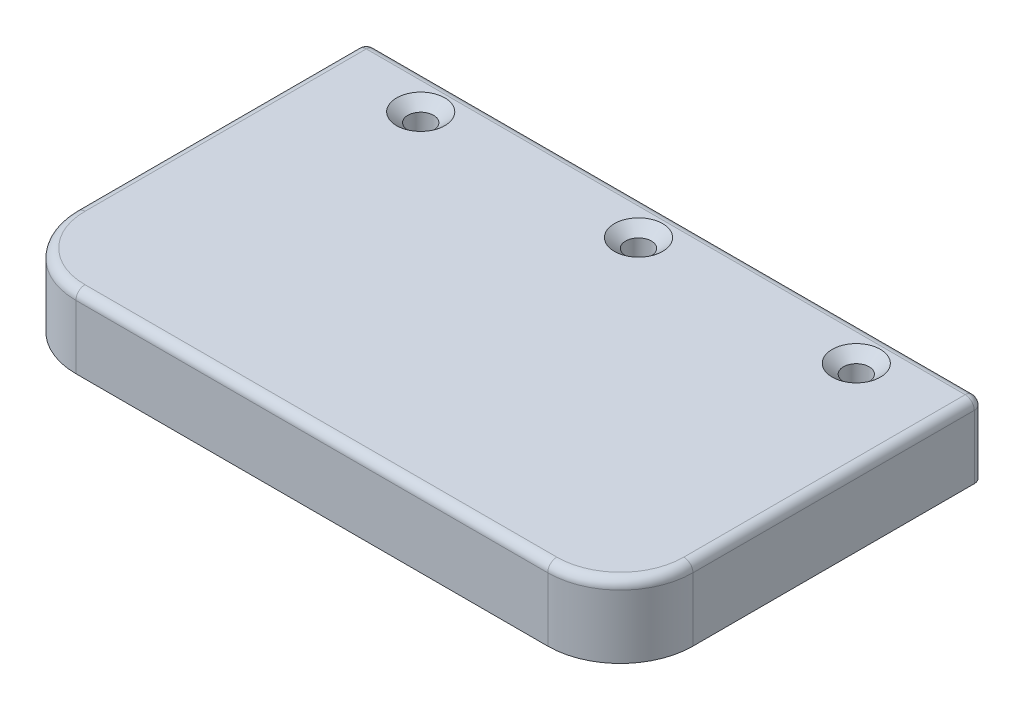
ISO-10303-21;
HEADER;
FILE_DESCRIPTION(('STEP AP214'),'2;1');
FILE_NAME('part.step','',(''),(''),'','','');
FILE_SCHEMA(('AUTOMOTIVE_DESIGN { 1 0 10303 214 1 1 1 1 }'));
ENDSEC;
DATA;
#1=APPLICATION_CONTEXT('core data for automotive mechanical design processes');
#2=APPLICATION_PROTOCOL_DEFINITION('international standard','automotive_design',2000,#1);
#3=PRODUCT_CONTEXT('',#1,'mechanical');
#4=PRODUCT('Part','Part','',(#3));
#5=PRODUCT_RELATED_PRODUCT_CATEGORY('part','',(#4));
#6=PRODUCT_DEFINITION_FORMATION('','',#4);
#7=PRODUCT_DEFINITION_CONTEXT('part definition',#1,'design');
#8=PRODUCT_DEFINITION('design','',#6,#7);
#9=PRODUCT_DEFINITION_SHAPE('','',#8);
#10=(LENGTH_UNIT() NAMED_UNIT(*) SI_UNIT(.MILLI.,.METRE.));
#11=(NAMED_UNIT(*) PLANE_ANGLE_UNIT() SI_UNIT($,.RADIAN.));
#12=(NAMED_UNIT(*) SI_UNIT($,.STERADIAN.) SOLID_ANGLE_UNIT());
#13=UNCERTAINTY_MEASURE_WITH_UNIT(LENGTH_MEASURE(1.E-05),#10,'distance_accuracy_value','');
#14=(GEOMETRIC_REPRESENTATION_CONTEXT(3) GLOBAL_UNCERTAINTY_ASSIGNED_CONTEXT((#13)) GLOBAL_UNIT_ASSIGNED_CONTEXT((#10,
#11,#12)) REPRESENTATION_CONTEXT('',''));
#15=CARTESIAN_POINT('',(0.,0.,0.));
#16=DIRECTION('',(0.,0.,1.));
#17=DIRECTION('',(1.,0.,0.));
#18=AXIS2_PLACEMENT_3D('',#15,#16,#17);
#19=CARTESIAN_POINT('',(53.975,-6.35,31.75));
#20=DIRECTION('',(-1.,0.,0.));
#21=DIRECTION('',(0.,0.,1.));
#22=AXIS2_PLACEMENT_3D('',#19,#20,#21);
#23=PLANE('',#22);
#24=DIRECTION('',(0.,1.,0.));
#25=VECTOR('',#24,1.);
#26=CARTESIAN_POINT('',(53.975,6.35,-30.1625));
#27=LINE('',#26,#25);
#28=CARTESIAN_POINT('',(53.975,-6.35,-30.1625));
#29=VERTEX_POINT('',#28);
#30=CARTESIAN_POINT('',(53.975,4.7625,-30.1625));
#31=VERTEX_POINT('',#30);
#32=EDGE_CURVE('E187',#29,#31,#27,.T.);
#33=ORIENTED_EDGE('',*,*,#32,.T.);
#34=DIRECTION('',(0.,0.,-1.));
#35=VECTOR('',#34,1.);
#36=CARTESIAN_POINT('',(53.975,4.7625,31.75));
#37=LINE('',#36,#35);
#38=CARTESIAN_POINT('',(53.975,4.7625,19.05));
#39=VERTEX_POINT('',#38);
#40=EDGE_CURVE('E189',#31,#39,#37,.F.);
#41=ORIENTED_EDGE('',*,*,#40,.T.);
#42=DIRECTION('',(0.,1.,0.));
#43=VECTOR('',#42,1.);
#44=CARTESIAN_POINT('',(53.975,-6.35,19.05));
#45=LINE('',#44,#43);
#46=CARTESIAN_POINT('',(53.975,-6.35,19.05));
#47=VERTEX_POINT('',#46);
#48=EDGE_CURVE('E160',#39,#47,#45,.F.);
#49=ORIENTED_EDGE('',*,*,#48,.T.);
#50=DIRECTION('',(0.,0.,-1.));
#51=VECTOR('',#50,1.);
#52=CARTESIAN_POINT('',(53.975,-6.35,31.75));
#53=LINE('',#52,#51);
#54=EDGE_CURVE('E143',#47,#29,#53,.T.);
#55=ORIENTED_EDGE('',*,*,#54,.T.);
#56=EDGE_LOOP('',(#33,#41,#49,#55));
#57=FACE_BOUND('',#56,.T.);
#58=ADVANCED_FACE('F35',(#57),#23,.F.);
#59=CARTESIAN_POINT('',(-53.975,6.35,31.75));
#60=DIRECTION('',(0.,-1.,0.));
#61=DIRECTION('',(0.,0.,-1.));
#62=AXIS2_PLACEMENT_3D('',#59,#60,#61);
#63=PLANE('',#62);
#64=DIRECTION('',(0.,0.,-1.));
#65=VECTOR('',#64,1.);
#66=CARTESIAN_POINT('',(52.3875,6.35,31.75));
#67=LINE('',#66,#65);
#68=CARTESIAN_POINT('',(52.3875,6.35,19.05));
#69=VERTEX_POINT('',#68);
#70=CARTESIAN_POINT('',(52.3875,6.35,-30.1625));
#71=VERTEX_POINT('',#70);
#72=EDGE_CURVE('E182',#69,#71,#67,.T.);
#73=ORIENTED_EDGE('',*,*,#72,.T.);
#74=DIRECTION('',(-1.,0.,0.));
#75=VECTOR('',#74,1.);
#76=CARTESIAN_POINT('',(-53.975,6.35,-30.1625));
#77=LINE('',#76,#75);
#78=CARTESIAN_POINT('',(-52.3875,6.35,-30.1625));
#79=VERTEX_POINT('',#78);
#80=EDGE_CURVE('E185',#71,#79,#77,.T.);
#81=ORIENTED_EDGE('',*,*,#80,.T.);
#82=DIRECTION('',(0.,0.,-1.));
#83=VECTOR('',#82,1.);
#84=CARTESIAN_POINT('',(-52.3875,6.35,31.75));
#85=LINE('',#84,#83);
#86=CARTESIAN_POINT('',(-52.3875,6.35,19.05));
#87=VERTEX_POINT('',#86);
#88=EDGE_CURVE('E178',#79,#87,#85,.F.);
#89=ORIENTED_EDGE('',*,*,#88,.T.);
#90=CARTESIAN_POINT('',(-41.275,6.35,19.05));
#91=DIRECTION('',(0.,-1.,0.));
#92=DIRECTION('',(0.,0.,-1.));
#93=AXIS2_PLACEMENT_3D('',#90,#91,#92);
#94=CIRCLE('',#93,11.1125);
#95=CARTESIAN_POINT('',(-41.275,6.35,30.1625));
#96=VERTEX_POINT('',#95);
#97=EDGE_CURVE('E176',#87,#96,#94,.F.);
#98=ORIENTED_EDGE('',*,*,#97,.T.);
#99=DIRECTION('',(-1.,0.,0.));
#100=VECTOR('',#99,1.);
#101=CARTESIAN_POINT('',(-53.975,6.35,30.1625));
#102=LINE('',#101,#100);
#103=CARTESIAN_POINT('',(41.275,6.35,30.1625));
#104=VERTEX_POINT('',#103);
#105=EDGE_CURVE('E162',#96,#104,#102,.F.);
#106=ORIENTED_EDGE('',*,*,#105,.T.);
#107=CARTESIAN_POINT('',(41.275,6.35,19.05));
#108=DIRECTION('',(0.,-1.,0.));
#109=DIRECTION('',(0.,0.,-1.));
#110=AXIS2_PLACEMENT_3D('',#107,#108,#109);
#111=CIRCLE('',#110,11.1125);
#112=EDGE_CURVE('E180',#104,#69,#111,.F.);
#113=ORIENTED_EDGE('',*,*,#112,.T.);
#114=EDGE_LOOP('',(#73,#81,#89,#98,#106,#113));
#115=FACE_BOUND('',#114,.T.);
#116=CARTESIAN_POINT('',(-38.1,6.35,-25.4));
#117=DIRECTION('',(0.,1.,0.));
#118=DIRECTION('',(0.,0.,1.));
#119=AXIS2_PLACEMENT_3D('',#116,#117,#118);
#120=CIRCLE('',#119,4.2164);
#121=CARTESIAN_POINT('',(-38.1,6.35,-21.1836));
#122=VERTEX_POINT('',#121);
#123=EDGE_CURVE('E235',#122,#122,#120,.T.);
#124=ORIENTED_EDGE('',*,*,#123,.F.);
#125=EDGE_LOOP('',(#124));
#126=FACE_BOUND('',#125,.T.);
#127=CARTESIAN_POINT('',(38.1,6.35,-25.4));
#128=DIRECTION('',(0.,1.,0.));
#129=DIRECTION('',(0.,0.,1.));
#130=AXIS2_PLACEMENT_3D('',#127,#128,#129);
#131=CIRCLE('',#130,4.2164);
#132=CARTESIAN_POINT('',(38.1,6.35,-21.1836));
#133=VERTEX_POINT('',#132);
#134=EDGE_CURVE('E173',#133,#133,#131,.T.);
#135=ORIENTED_EDGE('',*,*,#134,.F.);
#136=EDGE_LOOP('',(#135));
#137=FACE_BOUND('',#136,.T.);
#138=CARTESIAN_POINT('',(0.,6.35,-25.4));
#139=DIRECTION('',(0.,1.,0.));
#140=DIRECTION('',(0.,0.,1.));
#141=AXIS2_PLACEMENT_3D('',#138,#139,#140);
#142=CIRCLE('',#141,4.2164);
#143=CARTESIAN_POINT('',(0.,6.35,-21.1836));
#144=VERTEX_POINT('',#143);
#145=EDGE_CURVE('E168',#144,#144,#142,.T.);
#146=ORIENTED_EDGE('',*,*,#145,.F.);
#147=EDGE_LOOP('',(#146));
#148=FACE_BOUND('',#147,.T.);
#149=ADVANCED_FACE('F272',(#115,#126,#137,#148),#63,.F.);
#150=CARTESIAN_POINT('',(-53.975,-6.35,31.75));
#151=DIRECTION('',(1.,0.,0.));
#152=DIRECTION('',(0.,0.,-1.));
#153=AXIS2_PLACEMENT_3D('',#150,#151,#152);
#154=PLANE('',#153);
#155=DIRECTION('',(0.,-1.,0.));
#156=VECTOR('',#155,1.);
#157=CARTESIAN_POINT('',(-53.975,-6.35,19.05));
#158=LINE('',#157,#156);
#159=CARTESIAN_POINT('',(-53.975,-6.35,19.05));
#160=VERTEX_POINT('',#159);
#161=CARTESIAN_POINT('',(-53.975,4.7625,19.05));
#162=VERTEX_POINT('',#161);
#163=EDGE_CURVE('E135',#160,#162,#158,.F.);
#164=ORIENTED_EDGE('',*,*,#163,.T.);
#165=DIRECTION('',(0.,0.,-1.));
#166=VECTOR('',#165,1.);
#167=CARTESIAN_POINT('',(-53.975,4.7625,31.75));
#168=LINE('',#167,#166);
#169=CARTESIAN_POINT('',(-53.975,4.7625,-30.1625));
#170=VERTEX_POINT('',#169);
#171=EDGE_CURVE('E196',#162,#170,#168,.T.);
#172=ORIENTED_EDGE('',*,*,#171,.T.);
#173=DIRECTION('',(0.,-1.,0.));
#174=VECTOR('',#173,1.);
#175=CARTESIAN_POINT('',(-53.975,-6.35,-30.1625));
#176=LINE('',#175,#174);
#177=CARTESIAN_POINT('',(-53.975,-6.35,-30.1625));
#178=VERTEX_POINT('',#177);
#179=EDGE_CURVE('E194',#170,#178,#176,.T.);
#180=ORIENTED_EDGE('',*,*,#179,.T.);
#181=DIRECTION('',(0.,0.,-1.));
#182=VECTOR('',#181,1.);
#183=CARTESIAN_POINT('',(-53.975,-6.35,31.75));
#184=LINE('',#183,#182);
#185=EDGE_CURVE('E147',#160,#178,#184,.T.);
#186=ORIENTED_EDGE('',*,*,#185,.F.);
#187=EDGE_LOOP('',(#164,#172,#180,#186));
#188=FACE_BOUND('',#187,.T.);
#189=ADVANCED_FACE('F279',(#188),#154,.F.);
#190=CARTESIAN_POINT('',(-53.975,-6.35,31.75));
#191=DIRECTION('',(0.,1.,0.));
#192=DIRECTION('',(0.,0.,1.));
#193=AXIS2_PLACEMENT_3D('',#190,#191,#192);
#194=PLANE('',#193);
#195=CARTESIAN_POINT('',(-38.1,-6.35,-25.4));
#196=DIRECTION('',(0.,1.,0.));
#197=DIRECTION('',(0.,0.,1.));
#198=AXIS2_PLACEMENT_3D('',#195,#196,#197);
#199=CIRCLE('',#198,2.2479);
#200=CARTESIAN_POINT('',(-38.1,-6.35,-23.1521));
#201=VERTEX_POINT('',#200);
#202=EDGE_CURVE('E170',#201,#201,#199,.T.);
#203=ORIENTED_EDGE('',*,*,#202,.T.);
#204=EDGE_LOOP('',(#203));
#205=FACE_BOUND('',#204,.T.);
#206=CARTESIAN_POINT('',(38.1,-6.35,-25.4));
#207=DIRECTION('',(0.,1.,0.));
#208=DIRECTION('',(0.,0.,1.));
#209=AXIS2_PLACEMENT_3D('',#206,#207,#208);
#210=CIRCLE('',#209,2.2479);
#211=CARTESIAN_POINT('',(38.1,-6.35,-23.1521));
#212=VERTEX_POINT('',#211);
#213=EDGE_CURVE('E165',#212,#212,#210,.T.);
#214=ORIENTED_EDGE('',*,*,#213,.T.);
#215=EDGE_LOOP('',(#214));
#216=FACE_BOUND('',#215,.T.);
#217=CARTESIAN_POINT('',(0.,-6.35,-25.4));
#218=DIRECTION('',(0.,1.,0.));
#219=DIRECTION('',(0.,0.,1.));
#220=AXIS2_PLACEMENT_3D('',#217,#218,#219);
#221=CIRCLE('',#220,2.2479);
#222=CARTESIAN_POINT('',(0.,-6.35,-23.1521));
#223=VERTEX_POINT('',#222);
#224=EDGE_CURVE('E150',#223,#223,#221,.T.);
#225=ORIENTED_EDGE('',*,*,#224,.T.);
#226=EDGE_LOOP('',(#225));
#227=FACE_BOUND('',#226,.T.);
#228=ORIENTED_EDGE('',*,*,#185,.T.);
#229=CARTESIAN_POINT('',(-52.3875,-6.35,-30.1625));
#230=DIRECTION('',(0.,1.,0.));
#231=DIRECTION('',(0.,0.,1.));
#232=AXIS2_PLACEMENT_3D('',#229,#230,#231);
#233=CIRCLE('',#232,1.5875);
#234=CARTESIAN_POINT('',(-52.3875,-6.35,-31.75));
#235=VERTEX_POINT('',#234);
#236=EDGE_CURVE('E202',#178,#235,#233,.F.);
#237=ORIENTED_EDGE('',*,*,#236,.T.);
#238=DIRECTION('',(1.,0.,0.));
#239=VECTOR('',#238,1.);
#240=CARTESIAN_POINT('',(-53.975,-6.35,-31.75));
#241=LINE('',#240,#239);
#242=CARTESIAN_POINT('',(52.3875,-6.35,-31.75));
#243=VERTEX_POINT('',#242);
#244=EDGE_CURVE('E144',#235,#243,#241,.T.);
#245=ORIENTED_EDGE('',*,*,#244,.T.);
#246=CARTESIAN_POINT('',(52.3875,-6.35,-30.1625));
#247=DIRECTION('',(0.,1.,0.));
#248=DIRECTION('',(0.,0.,1.));
#249=AXIS2_PLACEMENT_3D('',#246,#247,#248);
#250=CIRCLE('',#249,1.5875);
#251=EDGE_CURVE('E200',#243,#29,#250,.F.);
#252=ORIENTED_EDGE('',*,*,#251,.T.);
#253=ORIENTED_EDGE('',*,*,#54,.F.);
#254=CARTESIAN_POINT('',(41.275,-6.35,19.05));
#255=DIRECTION('',(0.,1.,0.));
#256=DIRECTION('',(0.,0.,1.));
#257=AXIS2_PLACEMENT_3D('',#254,#255,#256);
#258=CIRCLE('',#257,12.7);
#259=CARTESIAN_POINT('',(41.275,-6.35,31.75));
#260=VERTEX_POINT('',#259);
#261=EDGE_CURVE('E128',#47,#260,#258,.F.);
#262=ORIENTED_EDGE('',*,*,#261,.T.);
#263=DIRECTION('',(1.,0.,0.));
#264=VECTOR('',#263,1.);
#265=CARTESIAN_POINT('',(-53.975,-6.35,31.75));
#266=LINE('',#265,#264);
#267=CARTESIAN_POINT('',(-41.275,-6.35,31.75));
#268=VERTEX_POINT('',#267);
#269=EDGE_CURVE('E123',#268,#260,#266,.T.);
#270=ORIENTED_EDGE('',*,*,#269,.F.);
#271=CARTESIAN_POINT('',(-41.275,-6.35,19.05));
#272=DIRECTION('',(0.,1.,0.));
#273=DIRECTION('',(0.,0.,1.));
#274=AXIS2_PLACEMENT_3D('',#271,#272,#273);
#275=CIRCLE('',#274,12.7);
#276=EDGE_CURVE('E132',#268,#160,#275,.F.);
#277=ORIENTED_EDGE('',*,*,#276,.T.);
#278=EDGE_LOOP('',(#228,#237,#245,#252,#253,#262,#270,#277));
#279=FACE_BOUND('',#278,.T.);
#280=ADVANCED_FACE('F140',(#205,#216,#227,#279),#194,.F.);
#281=CARTESIAN_POINT('',(0.,0.,31.75));
#282=DIRECTION('',(0.,0.,-1.));
#283=DIRECTION('',(-1.,0.,0.));
#284=AXIS2_PLACEMENT_3D('',#281,#282,#283);
#285=PLANE('',#284);
#286=DIRECTION('',(0.,1.,0.));
#287=VECTOR('',#286,1.);
#288=CARTESIAN_POINT('',(41.275,0.,31.75));
#289=LINE('',#288,#287);
#290=CARTESIAN_POINT('',(41.275,4.7625,31.75));
#291=VERTEX_POINT('',#290);
#292=EDGE_CURVE('E129',#260,#291,#289,.T.);
#293=ORIENTED_EDGE('',*,*,#292,.T.);
#294=DIRECTION('',(-1.,0.,0.));
#295=VECTOR('',#294,1.);
#296=CARTESIAN_POINT('',(0.,4.7625,31.75));
#297=LINE('',#296,#295);
#298=CARTESIAN_POINT('',(-41.275,4.7625,31.75));
#299=VERTEX_POINT('',#298);
#300=EDGE_CURVE('E11',#291,#299,#297,.T.);
#301=ORIENTED_EDGE('',*,*,#300,.T.);
#302=DIRECTION('',(0.,-1.,0.));
#303=VECTOR('',#302,1.);
#304=CARTESIAN_POINT('',(-41.275,0.,31.75));
#305=LINE('',#304,#303);
#306=EDGE_CURVE('E118',#299,#268,#305,.T.);
#307=ORIENTED_EDGE('',*,*,#306,.T.);
#308=ORIENTED_EDGE('',*,*,#269,.T.);
#309=EDGE_LOOP('',(#293,#301,#307,#308));
#310=FACE_BOUND('',#309,.T.);
#311=ADVANCED_FACE('F121',(#310),#285,.F.);
#312=CARTESIAN_POINT('',(0.,0.,-31.75));
#313=DIRECTION('',(0.,0.,-1.));
#314=DIRECTION('',(-1.,0.,0.));
#315=AXIS2_PLACEMENT_3D('',#312,#313,#314);
#316=PLANE('',#315);
#317=ORIENTED_EDGE('',*,*,#244,.F.);
#318=DIRECTION('',(0.,-1.,0.));
#319=VECTOR('',#318,1.);
#320=CARTESIAN_POINT('',(-52.3875,6.35,-31.75));
#321=LINE('',#320,#319);
#322=CARTESIAN_POINT('',(-52.3875,4.7625,-31.75));
#323=VERTEX_POINT('',#322);
#324=EDGE_CURVE('E44',#235,#323,#321,.F.);
#325=ORIENTED_EDGE('',*,*,#324,.T.);
#326=DIRECTION('',(-1.,0.,0.));
#327=VECTOR('',#326,1.);
#328=CARTESIAN_POINT('',(53.975,4.7625,-31.75));
#329=LINE('',#328,#327);
#330=CARTESIAN_POINT('',(52.3875,4.7625,-31.75));
#331=VERTEX_POINT('',#330);
#332=EDGE_CURVE('E52',#323,#331,#329,.F.);
#333=ORIENTED_EDGE('',*,*,#332,.T.);
#334=DIRECTION('',(0.,1.,0.));
#335=VECTOR('',#334,1.);
#336=CARTESIAN_POINT('',(52.3875,-6.35,-31.75));
#337=LINE('',#336,#335);
#338=EDGE_CURVE('E205',#331,#243,#337,.F.);
#339=ORIENTED_EDGE('',*,*,#338,.T.);
#340=EDGE_LOOP('',(#317,#325,#333,#339));
#341=FACE_BOUND('',#340,.T.);
#342=ADVANCED_FACE('F286',(#341),#316,.T.);
#343=CARTESIAN_POINT('',(-41.275,0.,19.05));
#344=DIRECTION('',(0.,-1.,0.));
#345=DIRECTION('',(0.,0.,-1.));
#346=AXIS2_PLACEMENT_3D('',#343,#344,#345);
#347=CYLINDRICAL_SURFACE('',#346,12.7);
#348=ORIENTED_EDGE('',*,*,#306,.F.);
#349=CARTESIAN_POINT('',(-41.275,4.7625,19.05));
#350=DIRECTION('',(0.,-1.,0.));
#351=DIRECTION('',(0.,0.,-1.));
#352=AXIS2_PLACEMENT_3D('',#349,#350,#351);
#353=CIRCLE('',#352,12.7);
#354=EDGE_CURVE('E198',#299,#162,#353,.T.);
#355=ORIENTED_EDGE('',*,*,#354,.T.);
#356=ORIENTED_EDGE('',*,*,#163,.F.);
#357=ORIENTED_EDGE('',*,*,#276,.F.);
#358=EDGE_LOOP('',(#348,#355,#356,#357));
#359=FACE_BOUND('',#358,.T.);
#360=ADVANCED_FACE('F133',(#359),#347,.T.);
#361=CARTESIAN_POINT('',(41.275,0.,19.05));
#362=DIRECTION('',(0.,1.,0.));
#363=DIRECTION('',(0.,0.,1.));
#364=AXIS2_PLACEMENT_3D('',#361,#362,#363);
#365=CYLINDRICAL_SURFACE('',#364,12.7);
#366=ORIENTED_EDGE('',*,*,#48,.F.);
#367=CARTESIAN_POINT('',(41.275,4.7625,19.05));
#368=DIRECTION('',(0.,-1.,0.));
#369=DIRECTION('',(0.,0.,-1.));
#370=AXIS2_PLACEMENT_3D('',#367,#368,#369);
#371=CIRCLE('',#370,12.7);
#372=EDGE_CURVE('E192',#39,#291,#371,.T.);
#373=ORIENTED_EDGE('',*,*,#372,.T.);
#374=ORIENTED_EDGE('',*,*,#292,.F.);
#375=ORIENTED_EDGE('',*,*,#261,.F.);
#376=EDGE_LOOP('',(#366,#373,#374,#375));
#377=FACE_BOUND('',#376,.T.);
#378=ADVANCED_FACE('F269',(#377),#365,.T.);
#379=CARTESIAN_POINT('',(0.,6.35,-25.4));
#380=DIRECTION('',(0.,1.,0.));
#381=DIRECTION('',(0.,0.,1.));
#382=AXIS2_PLACEMENT_3D('',#379,#380,#381);
#383=CYLINDRICAL_SURFACE('',#382,2.2479);
#384=CARTESIAN_POINT('',(0.,4.69823237602752,-25.4));
#385=DIRECTION('',(0.,1.,0.));
#386=DIRECTION('',(0.,0.,1.));
#387=AXIS2_PLACEMENT_3D('',#384,#385,#386);
#388=CIRCLE('',#387,2.2479);
#389=CARTESIAN_POINT('',(0.,4.69823237602752,-23.1521));
#390=VERTEX_POINT('',#389);
#391=EDGE_CURVE('E153',#390,#390,#388,.T.);
#392=ORIENTED_EDGE('',*,*,#391,.T.);
#393=EDGE_LOOP('',(#392));
#394=FACE_BOUND('',#393,.T.);
#395=ORIENTED_EDGE('',*,*,#224,.F.);
#396=EDGE_LOOP('',(#395));
#397=FACE_BOUND('',#396,.T.);
#398=ADVANCED_FACE('F255',(#394,#397),#383,.F.);
#399=CARTESIAN_POINT('',(0.,6.35,-25.4));
#400=DIRECTION('',(0.,1.,0.));
#401=DIRECTION('',(0.,0.,1.));
#402=AXIS2_PLACEMENT_3D('',#399,#400,#401);
#403=CONICAL_SURFACE('',#402,4.2164,0.872664625997165);
#404=ORIENTED_EDGE('',*,*,#391,.F.);
#405=EDGE_LOOP('',(#404));
#406=FACE_BOUND('',#405,.T.);
#407=ORIENTED_EDGE('',*,*,#145,.T.);
#408=EDGE_LOOP('',(#407));
#409=FACE_BOUND('',#408,.T.);
#410=ADVANCED_FACE('F258',(#406,#409),#403,.F.);
#411=CARTESIAN_POINT('',(38.1,6.35,-25.4));
#412=DIRECTION('',(0.,1.,0.));
#413=DIRECTION('',(0.,0.,1.));
#414=AXIS2_PLACEMENT_3D('',#411,#412,#413);
#415=CYLINDRICAL_SURFACE('',#414,2.2479);
#416=CARTESIAN_POINT('',(38.1,4.69823237602752,-25.4));
#417=DIRECTION('',(0.,1.,0.));
#418=DIRECTION('',(0.,0.,1.));
#419=AXIS2_PLACEMENT_3D('',#416,#417,#418);
#420=CIRCLE('',#419,2.2479);
#421=CARTESIAN_POINT('',(38.1,4.69823237602752,-23.1521));
#422=VERTEX_POINT('',#421);
#423=EDGE_CURVE('E169',#422,#422,#420,.T.);
#424=ORIENTED_EDGE('',*,*,#423,.T.);
#425=EDGE_LOOP('',(#424));
#426=FACE_BOUND('',#425,.T.);
#427=ORIENTED_EDGE('',*,*,#213,.F.);
#428=EDGE_LOOP('',(#427));
#429=FACE_BOUND('',#428,.T.);
#430=ADVANCED_FACE('F260',(#426,#429),#415,.F.);
#431=CARTESIAN_POINT('',(38.1,6.35,-25.4));
#432=DIRECTION('',(0.,1.,0.));
#433=DIRECTION('',(0.,0.,1.));
#434=AXIS2_PLACEMENT_3D('',#431,#432,#433);
#435=CONICAL_SURFACE('',#434,4.2164,0.872664625997165);
#436=ORIENTED_EDGE('',*,*,#423,.F.);
#437=EDGE_LOOP('',(#436));
#438=FACE_BOUND('',#437,.T.);
#439=ORIENTED_EDGE('',*,*,#134,.T.);
#440=EDGE_LOOP('',(#439));
#441=FACE_BOUND('',#440,.T.);
#442=ADVANCED_FACE('F266',(#438,#441),#435,.F.);
#443=CARTESIAN_POINT('',(-38.1,6.35,-25.4));
#444=DIRECTION('',(0.,1.,0.));
#445=DIRECTION('',(0.,0.,1.));
#446=AXIS2_PLACEMENT_3D('',#443,#444,#445);
#447=CYLINDRICAL_SURFACE('',#446,2.2479);
#448=CARTESIAN_POINT('',(-38.1,4.69823237602752,-25.4));
#449=DIRECTION('',(0.,1.,0.));
#450=DIRECTION('',(0.,0.,1.));
#451=AXIS2_PLACEMENT_3D('',#448,#449,#450);
#452=CIRCLE('',#451,2.2479);
#453=CARTESIAN_POINT('',(-38.1,4.69823237602752,-23.1521));
#454=VERTEX_POINT('',#453);
#455=EDGE_CURVE('E174',#454,#454,#452,.T.);
#456=ORIENTED_EDGE('',*,*,#455,.T.);
#457=EDGE_LOOP('',(#456));
#458=FACE_BOUND('',#457,.T.);
#459=ORIENTED_EDGE('',*,*,#202,.F.);
#460=EDGE_LOOP('',(#459));
#461=FACE_BOUND('',#460,.T.);
#462=ADVANCED_FACE('F438',(#458,#461),#447,.F.);
#463=CARTESIAN_POINT('',(-38.1,6.35,-25.4));
#464=DIRECTION('',(0.,1.,0.));
#465=DIRECTION('',(0.,0.,1.));
#466=AXIS2_PLACEMENT_3D('',#463,#464,#465);
#467=CONICAL_SURFACE('',#466,4.2164,0.872664625997165);
#468=ORIENTED_EDGE('',*,*,#455,.F.);
#469=EDGE_LOOP('',(#468));
#470=FACE_BOUND('',#469,.T.);
#471=ORIENTED_EDGE('',*,*,#123,.T.);
#472=EDGE_LOOP('',(#471));
#473=FACE_BOUND('',#472,.T.);
#474=ADVANCED_FACE('F325',(#470,#473),#467,.F.);
#475=CARTESIAN_POINT('',(-52.3875,4.7625,31.75));
#476=DIRECTION('',(0.,0.,-1.));
#477=DIRECTION('',(-1.,0.,0.));
#478=AXIS2_PLACEMENT_3D('',#475,#476,#477);
#479=CYLINDRICAL_SURFACE('',#478,1.5875);
#480=CARTESIAN_POINT('',(-52.3875,4.7625,-30.1625));
#481=DIRECTION('',(0.,0.,-1.));
#482=DIRECTION('',(-1.,0.,0.));
#483=AXIS2_PLACEMENT_3D('',#480,#481,#482);
#484=CIRCLE('',#483,1.5875);
#485=EDGE_CURVE('E229',#170,#79,#484,.T.);
#486=ORIENTED_EDGE('',*,*,#485,.F.);
#487=ORIENTED_EDGE('',*,*,#171,.F.);
#488=CARTESIAN_POINT('',(-52.3875,4.7625,19.05));
#489=DIRECTION('',(0.,0.,1.));
#490=DIRECTION('',(1.,0.,0.));
#491=AXIS2_PLACEMENT_3D('',#488,#489,#490);
#492=CIRCLE('',#491,1.5875);
#493=EDGE_CURVE('E39',#87,#162,#492,.T.);
#494=ORIENTED_EDGE('',*,*,#493,.F.);
#495=ORIENTED_EDGE('',*,*,#88,.F.);
#496=EDGE_LOOP('',(#486,#487,#494,#495));
#497=FACE_BOUND('',#496,.T.);
#498=ADVANCED_FACE('F37',(#497),#479,.T.);
#499=CARTESIAN_POINT('',(-52.3875,-6.35,-30.1625));
#500=DIRECTION('',(0.,1.,0.));
#501=DIRECTION('',(0.,0.,1.));
#502=AXIS2_PLACEMENT_3D('',#499,#500,#501);
#503=CYLINDRICAL_SURFACE('',#502,1.5875);
#504=ORIENTED_EDGE('',*,*,#236,.F.);
#505=ORIENTED_EDGE('',*,*,#179,.F.);
#506=CARTESIAN_POINT('',(-52.3875,4.7625,-30.1625));
#507=DIRECTION('',(0.,1.,0.));
#508=DIRECTION('',(0.,0.,1.));
#509=AXIS2_PLACEMENT_3D('',#506,#507,#508);
#510=CIRCLE('',#509,1.5875);
#511=EDGE_CURVE('E227',#323,#170,#510,.T.);
#512=ORIENTED_EDGE('',*,*,#511,.F.);
#513=ORIENTED_EDGE('',*,*,#324,.F.);
#514=EDGE_LOOP('',(#504,#505,#512,#513));
#515=FACE_BOUND('',#514,.T.);
#516=ADVANCED_FACE('F319',(#515),#503,.T.);
#517=CARTESIAN_POINT('',(-41.275,4.7625,19.05));
#518=DIRECTION('',(0.,-1.,0.));
#519=DIRECTION('',(0.,0.,-1.));
#520=AXIS2_PLACEMENT_3D('',#517,#518,#519);
#521=TOROIDAL_SURFACE('',#520,11.1125,1.5875);
#522=ORIENTED_EDGE('',*,*,#493,.T.);
#523=ORIENTED_EDGE('',*,*,#354,.F.);
#524=CARTESIAN_POINT('',(-41.275,4.7625,30.1625));
#525=DIRECTION('',(1.,0.,0.));
#526=DIRECTION('',(0.,0.,-1.));
#527=AXIS2_PLACEMENT_3D('',#524,#525,#526);
#528=CIRCLE('',#527,1.5875);
#529=EDGE_CURVE('E224',#96,#299,#528,.T.);
#530=ORIENTED_EDGE('',*,*,#529,.F.);
#531=ORIENTED_EDGE('',*,*,#97,.F.);
#532=EDGE_LOOP('',(#522,#523,#530,#531));
#533=FACE_BOUND('',#532,.T.);
#534=ADVANCED_FACE('F317',(#533),#521,.T.);
#535=CARTESIAN_POINT('',(-52.3875,4.7625,-30.1625));
#536=DIRECTION('',(0.,0.,1.));
#537=DIRECTION('',(1.,0.,0.));
#538=AXIS2_PLACEMENT_3D('',#535,#536,#537);
#539=SPHERICAL_SURFACE('',#538,1.5875);
#540=ORIENTED_EDGE('',*,*,#511,.T.);
#541=ORIENTED_EDGE('',*,*,#485,.T.);
#542=CARTESIAN_POINT('',(-52.3875,4.7625,-30.1625));
#543=DIRECTION('',(-1.,0.,0.));
#544=DIRECTION('',(0.,0.,1.));
#545=AXIS2_PLACEMENT_3D('',#542,#543,#544);
#546=CIRCLE('',#545,1.5875);
#547=EDGE_CURVE('E221',#323,#79,#546,.F.);
#548=ORIENTED_EDGE('',*,*,#547,.F.);
#549=EDGE_LOOP('',(#540,#541,#548));
#550=FACE_BOUND('',#549,.T.);
#551=ADVANCED_FACE('F313',(#550),#539,.T.);
#552=CARTESIAN_POINT('',(0.,4.7625,30.1625));
#553=DIRECTION('',(-1.,0.,0.));
#554=DIRECTION('',(0.,0.,1.));
#555=AXIS2_PLACEMENT_3D('',#552,#553,#554);
#556=CYLINDRICAL_SURFACE('',#555,1.5875);
#557=ORIENTED_EDGE('',*,*,#529,.T.);
#558=ORIENTED_EDGE('',*,*,#300,.F.);
#559=CARTESIAN_POINT('',(41.275,4.7625,30.1625));
#560=DIRECTION('',(1.,0.,0.));
#561=DIRECTION('',(0.,0.,-1.));
#562=AXIS2_PLACEMENT_3D('',#559,#560,#561);
#563=CIRCLE('',#562,1.5875);
#564=EDGE_CURVE('E218',#104,#291,#563,.T.);
#565=ORIENTED_EDGE('',*,*,#564,.F.);
#566=ORIENTED_EDGE('',*,*,#105,.F.);
#567=EDGE_LOOP('',(#557,#558,#565,#566));
#568=FACE_BOUND('',#567,.T.);
#569=ADVANCED_FACE('F309',(#568),#556,.T.);
#570=CARTESIAN_POINT('',(-53.975,4.7625,-30.1625));
#571=DIRECTION('',(1.,0.,0.));
#572=DIRECTION('',(0.,0.,-1.));
#573=AXIS2_PLACEMENT_3D('',#570,#571,#572);
#574=CYLINDRICAL_SURFACE('',#573,1.5875);
#575=ORIENTED_EDGE('',*,*,#547,.T.);
#576=ORIENTED_EDGE('',*,*,#80,.F.);
#577=CARTESIAN_POINT('',(52.3875,4.7625,-30.1625));
#578=DIRECTION('',(1.,0.,0.));
#579=DIRECTION('',(0.,1.,0.));
#580=AXIS2_PLACEMENT_3D('',#577,#578,#579);
#581=CIRCLE('',#580,1.5875);
#582=EDGE_CURVE('E215',#331,#71,#581,.T.);
#583=ORIENTED_EDGE('',*,*,#582,.F.);
#584=ORIENTED_EDGE('',*,*,#332,.F.);
#585=EDGE_LOOP('',(#575,#576,#583,#584));
#586=FACE_BOUND('',#585,.T.);
#587=ADVANCED_FACE('F305',(#586),#574,.T.);
#588=CARTESIAN_POINT('',(52.3875,-6.35,-30.1625));
#589=DIRECTION('',(0.,-1.,0.));
#590=DIRECTION('',(0.,0.,-1.));
#591=AXIS2_PLACEMENT_3D('',#588,#589,#590);
#592=CYLINDRICAL_SURFACE('',#591,1.5875);
#593=ORIENTED_EDGE('',*,*,#251,.F.);
#594=ORIENTED_EDGE('',*,*,#338,.F.);
#595=CARTESIAN_POINT('',(52.3875,4.7625,-30.1625));
#596=DIRECTION('',(0.,1.,0.));
#597=DIRECTION('',(0.,0.,1.));
#598=AXIS2_PLACEMENT_3D('',#595,#596,#597);
#599=CIRCLE('',#598,1.5875);
#600=EDGE_CURVE('E212',#31,#331,#599,.T.);
#601=ORIENTED_EDGE('',*,*,#600,.F.);
#602=ORIENTED_EDGE('',*,*,#32,.F.);
#603=EDGE_LOOP('',(#593,#594,#601,#602));
#604=FACE_BOUND('',#603,.T.);
#605=ADVANCED_FACE('F301',(#604),#592,.T.);
#606=CARTESIAN_POINT('',(41.275,4.7625,19.05));
#607=DIRECTION('',(0.,-1.,0.));
#608=DIRECTION('',(0.,0.,-1.));
#609=AXIS2_PLACEMENT_3D('',#606,#607,#608);
#610=TOROIDAL_SURFACE('',#609,11.1125,1.5875);
#611=ORIENTED_EDGE('',*,*,#564,.T.);
#612=ORIENTED_EDGE('',*,*,#372,.F.);
#613=CARTESIAN_POINT('',(52.3875,4.7625,19.05));
#614=DIRECTION('',(0.,0.,-1.));
#615=DIRECTION('',(-1.,0.,0.));
#616=AXIS2_PLACEMENT_3D('',#613,#614,#615);
#617=CIRCLE('',#616,1.5875);
#618=EDGE_CURVE('E210',#69,#39,#617,.T.);
#619=ORIENTED_EDGE('',*,*,#618,.F.);
#620=ORIENTED_EDGE('',*,*,#112,.F.);
#621=EDGE_LOOP('',(#611,#612,#619,#620));
#622=FACE_BOUND('',#621,.T.);
#623=ADVANCED_FACE('F297',(#622),#610,.T.);
#624=CARTESIAN_POINT('',(52.3875,4.7625,-30.1625));
#625=DIRECTION('',(0.,0.,1.));
#626=DIRECTION('',(1.,0.,0.));
#627=AXIS2_PLACEMENT_3D('',#624,#625,#626);
#628=SPHERICAL_SURFACE('',#627,1.5875);
#629=ORIENTED_EDGE('',*,*,#600,.T.);
#630=ORIENTED_EDGE('',*,*,#582,.T.);
#631=CARTESIAN_POINT('',(52.3875,4.7625,-30.1625));
#632=DIRECTION('',(0.,0.,-1.));
#633=DIRECTION('',(-1.,0.,0.));
#634=AXIS2_PLACEMENT_3D('',#631,#632,#633);
#635=CIRCLE('',#634,1.5875);
#636=EDGE_CURVE('E208',#31,#71,#635,.F.);
#637=ORIENTED_EDGE('',*,*,#636,.F.);
#638=EDGE_LOOP('',(#629,#630,#637));
#639=FACE_BOUND('',#638,.T.);
#640=ADVANCED_FACE('F293',(#639),#628,.T.);
#641=CARTESIAN_POINT('',(52.3875,4.7625,31.75));
#642=DIRECTION('',(0.,0.,-1.));
#643=DIRECTION('',(-1.,0.,0.));
#644=AXIS2_PLACEMENT_3D('',#641,#642,#643);
#645=CYLINDRICAL_SURFACE('',#644,1.5875);
#646=ORIENTED_EDGE('',*,*,#618,.T.);
#647=ORIENTED_EDGE('',*,*,#40,.F.);
#648=ORIENTED_EDGE('',*,*,#636,.T.);
#649=ORIENTED_EDGE('',*,*,#72,.F.);
#650=EDGE_LOOP('',(#646,#647,#648,#649));
#651=FACE_BOUND('',#650,.T.);
#652=ADVANCED_FACE('F290',(#651),#645,.T.);
#653=CLOSED_SHELL('',(#58,#149,#189,#280,#311,#342,#360,#378,#398,#410,#430,#442,#462,#474,#498,
#516,#534,#551,#569,#587,#605,#623,#640,#652));
#654=MANIFOLD_SOLID_BREP('B2',#653);
#655=ADVANCED_BREP_SHAPE_REPRESENTATION('',(#18,#654),#14);
#656=SHAPE_DEFINITION_REPRESENTATION(#9,#655);
ENDSEC;
END-ISO-10303-21;
